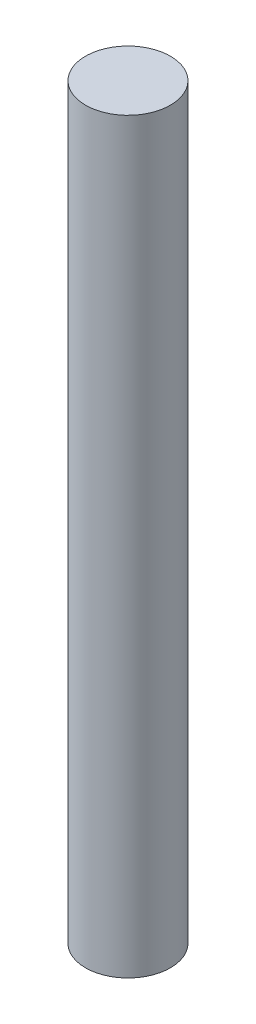
ISO-10303-21;
HEADER;
FILE_DESCRIPTION(('STEP AP214'),'2;1');
FILE_NAME('part.step','',(''),(''),'','','');
FILE_SCHEMA(('AUTOMOTIVE_DESIGN { 1 0 10303 214 1 1 1 1 }'));
ENDSEC;
DATA;
#1=APPLICATION_CONTEXT('core data for automotive mechanical design processes');
#2=APPLICATION_PROTOCOL_DEFINITION('international standard','automotive_design',2000,#1);
#3=PRODUCT_CONTEXT('',#1,'mechanical');
#4=PRODUCT('Part','Part','',(#3));
#5=PRODUCT_RELATED_PRODUCT_CATEGORY('part','',(#4));
#6=PRODUCT_DEFINITION_FORMATION('','',#4);
#7=PRODUCT_DEFINITION_CONTEXT('part definition',#1,'design');
#8=PRODUCT_DEFINITION('design','',#6,#7);
#9=PRODUCT_DEFINITION_SHAPE('','',#8);
#10=(LENGTH_UNIT() NAMED_UNIT(*) SI_UNIT(.MILLI.,.METRE.));
#11=(NAMED_UNIT(*) PLANE_ANGLE_UNIT() SI_UNIT($,.RADIAN.));
#12=(NAMED_UNIT(*) SI_UNIT($,.STERADIAN.) SOLID_ANGLE_UNIT());
#13=UNCERTAINTY_MEASURE_WITH_UNIT(LENGTH_MEASURE(1.E-05),#10,'distance_accuracy_value','');
#14=(GEOMETRIC_REPRESENTATION_CONTEXT(3) GLOBAL_UNCERTAINTY_ASSIGNED_CONTEXT((#13)) GLOBAL_UNIT_ASSIGNED_CONTEXT((#10,
#11,#12)) REPRESENTATION_CONTEXT('',''));
#15=CARTESIAN_POINT('',(0.,0.,0.));
#16=DIRECTION('',(0.,0.,1.));
#17=DIRECTION('',(1.,0.,0.));
#18=AXIS2_PLACEMENT_3D('',#15,#16,#17);
#19=CARTESIAN_POINT('',(0.,22.,0.));
#20=DIRECTION('',(0.,-1.,0.));
#21=DIRECTION('',(0.,0.,-1.));
#22=AXIS2_PLACEMENT_3D('',#19,#20,#21);
#23=CYLINDRICAL_SURFACE('',#22,1.25);
#24=CARTESIAN_POINT('',(0.,22.,0.));
#25=DIRECTION('',(0.,1.,0.));
#26=DIRECTION('',(0.,0.,1.));
#27=AXIS2_PLACEMENT_3D('',#24,#25,#26);
#28=CIRCLE('',#27,1.25);
#29=CARTESIAN_POINT('',(0.,22.,1.25));
#30=VERTEX_POINT('',#29);
#31=EDGE_CURVE('E10',#30,#30,#28,.T.);
#32=ORIENTED_EDGE('',*,*,#31,.F.);
#33=EDGE_LOOP('',(#32));
#34=FACE_BOUND('',#33,.T.);
#35=CARTESIAN_POINT('',(0.,0.,0.));
#36=DIRECTION('',(0.,1.,0.));
#37=DIRECTION('',(0.,0.,1.));
#38=AXIS2_PLACEMENT_3D('',#35,#36,#37);
#39=CIRCLE('',#38,1.25);
#40=CARTESIAN_POINT('',(0.,0.,1.25));
#41=VERTEX_POINT('',#40);
#42=EDGE_CURVE('E34',#41,#41,#39,.T.);
#43=ORIENTED_EDGE('',*,*,#42,.T.);
#44=EDGE_LOOP('',(#43));
#45=FACE_BOUND('',#44,.T.);
#46=ADVANCED_FACE('F31',(#34,#45),#23,.T.);
#47=CARTESIAN_POINT('',(0.,22.,0.));
#48=DIRECTION('',(0.,1.,0.));
#49=DIRECTION('',(0.,0.,1.));
#50=AXIS2_PLACEMENT_3D('',#47,#48,#49);
#51=PLANE('',#50);
#52=ORIENTED_EDGE('',*,*,#31,.T.);
#53=EDGE_LOOP('',(#52));
#54=FACE_BOUND('',#53,.T.);
#55=ADVANCED_FACE('F46',(#54),#51,.T.);
#56=CARTESIAN_POINT('',(0.,0.,0.));
#57=DIRECTION('',(0.,1.,0.));
#58=DIRECTION('',(0.,0.,1.));
#59=AXIS2_PLACEMENT_3D('',#56,#57,#58);
#60=PLANE('',#59);
#61=ORIENTED_EDGE('',*,*,#42,.F.);
#62=EDGE_LOOP('',(#61));
#63=FACE_BOUND('',#62,.T.);
#64=ADVANCED_FACE('F44',(#63),#60,.F.);
#65=CLOSED_SHELL('',(#46,#55,#64));
#66=MANIFOLD_SOLID_BREP('B2',#65);
#67=ADVANCED_BREP_SHAPE_REPRESENTATION('',(#18,#66),#14);
#68=SHAPE_DEFINITION_REPRESENTATION(#9,#67);
ENDSEC;
END-ISO-10303-21;
